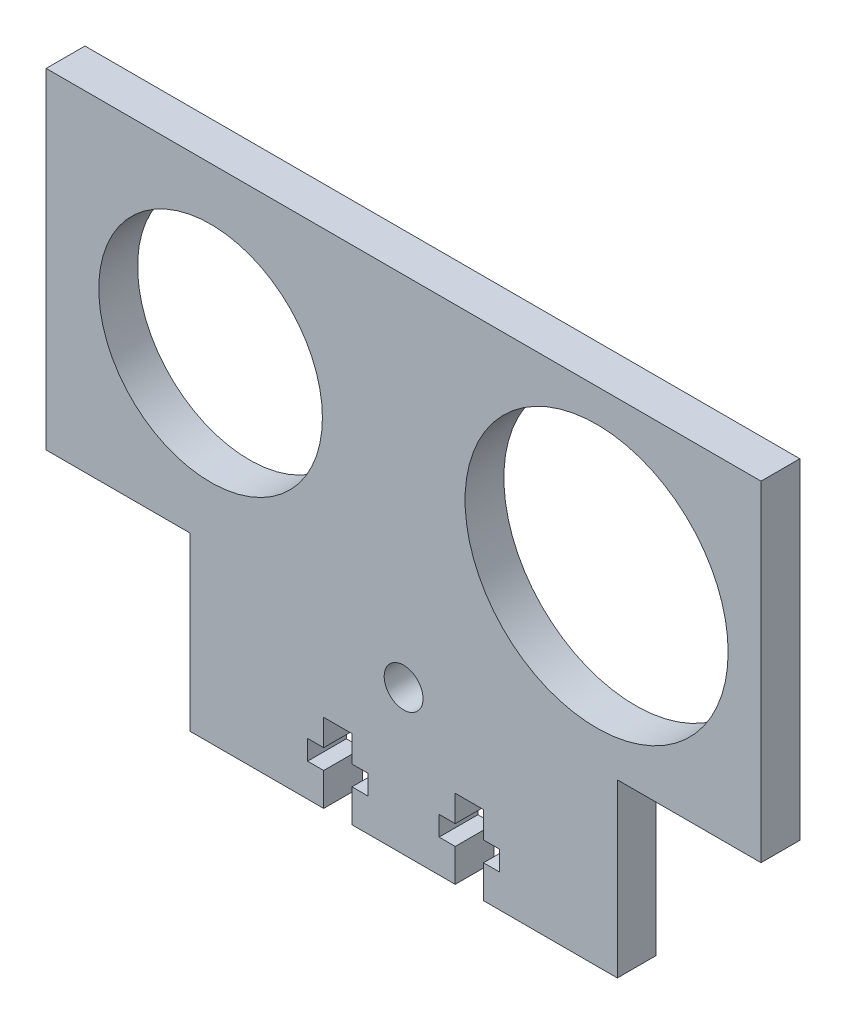
ISO-10303-21;
HEADER;
FILE_DESCRIPTION(('STEP AP214'),'2;1');
FILE_NAME('part.step','',(''),(''),'','','');
FILE_SCHEMA(('AUTOMOTIVE_DESIGN { 1 0 10303 214 1 1 1 1 }'));
ENDSEC;
DATA;
#1=APPLICATION_CONTEXT('core data for automotive mechanical design processes');
#2=APPLICATION_PROTOCOL_DEFINITION('international standard','automotive_design',2000,#1);
#3=PRODUCT_CONTEXT('',#1,'mechanical');
#4=PRODUCT('Part','Part','',(#3));
#5=PRODUCT_RELATED_PRODUCT_CATEGORY('part','',(#4));
#6=PRODUCT_DEFINITION_FORMATION('','',#4);
#7=PRODUCT_DEFINITION_CONTEXT('part definition',#1,'design');
#8=PRODUCT_DEFINITION('design','',#6,#7);
#9=PRODUCT_DEFINITION_SHAPE('','',#8);
#10=(LENGTH_UNIT() NAMED_UNIT(*) SI_UNIT(.MILLI.,.METRE.));
#11=(NAMED_UNIT(*) PLANE_ANGLE_UNIT() SI_UNIT($,.RADIAN.));
#12=(NAMED_UNIT(*) SI_UNIT($,.STERADIAN.) SOLID_ANGLE_UNIT());
#13=UNCERTAINTY_MEASURE_WITH_UNIT(LENGTH_MEASURE(1.E-05),#10,'distance_accuracy_value','');
#14=(GEOMETRIC_REPRESENTATION_CONTEXT(3) GLOBAL_UNCERTAINTY_ASSIGNED_CONTEXT((#13)) GLOBAL_UNIT_ASSIGNED_CONTEXT((#10,
#11,#12)) REPRESENTATION_CONTEXT('',''));
#15=CARTESIAN_POINT('',(0.,0.,0.));
#16=DIRECTION('',(0.,0.,1.));
#17=DIRECTION('',(1.,0.,0.));
#18=AXIS2_PLACEMENT_3D('',#15,#16,#17);
#19=CARTESIAN_POINT('',(-32.5,-22.,5.9));
#20=DIRECTION('',(0.,1.,0.));
#21=DIRECTION('',(-1.,0.,0.));
#22=AXIS2_PLACEMENT_3D('',#19,#20,#21);
#23=PLANE('',#22);
#24=DIRECTION('',(1.,0.,0.));
#25=VECTOR('',#24,1.);
#26=CARTESIAN_POINT('',(-32.5,-22.,5.9));
#27=LINE('',#26,#25);
#28=CARTESIAN_POINT('',(12.15,-22.,5.9));
#29=VERTEX_POINT('',#28);
#30=CARTESIAN_POINT('',(32.5,-22.,5.9));
#31=VERTEX_POINT('',#30);
#32=EDGE_CURVE('E464',#29,#31,#27,.T.);
#33=ORIENTED_EDGE('',*,*,#32,.F.);
#34=DIRECTION('',(0.,0.,1.));
#35=VECTOR('',#34,1.);
#36=CARTESIAN_POINT('',(12.15,-22.,0.));
#37=LINE('',#36,#35);
#38=CARTESIAN_POINT('',(12.15,-22.,0.));
#39=VERTEX_POINT('',#38);
#40=EDGE_CURVE('E335',#39,#29,#37,.T.);
#41=ORIENTED_EDGE('',*,*,#40,.F.);
#42=DIRECTION('',(1.,0.,0.));
#43=VECTOR('',#42,1.);
#44=CARTESIAN_POINT('',(-32.5,-22.,0.));
#45=LINE('',#44,#43);
#46=CARTESIAN_POINT('',(32.5,-22.,0.));
#47=VERTEX_POINT('',#46);
#48=EDGE_CURVE('E484',#39,#47,#45,.T.);
#49=ORIENTED_EDGE('',*,*,#48,.T.);
#50=DIRECTION('',(0.,0.,-1.));
#51=VECTOR('',#50,1.);
#52=CARTESIAN_POINT('',(32.5,-22.,5.9));
#53=LINE('',#52,#51);
#54=EDGE_CURVE('E468',#31,#47,#53,.T.);
#55=ORIENTED_EDGE('',*,*,#54,.F.);
#56=EDGE_LOOP('',(#33,#41,#49,#55));
#57=FACE_BOUND('',#56,.T.);
#58=ADVANCED_FACE('F32',(#57),#23,.F.);
#59=CARTESIAN_POINT('',(-32.5,-22.,0.));
#60=VERTEX_POINT('',#59);
#61=CARTESIAN_POINT('',(-12.15,-22.,0.));
#62=VERTEX_POINT('',#61);
#63=EDGE_CURVE('E452',#60,#62,#45,.T.);
#64=ORIENTED_EDGE('',*,*,#63,.T.);
#65=DIRECTION('',(0.,0.,1.));
#66=VECTOR('',#65,1.);
#67=CARTESIAN_POINT('',(-12.15,-22.,0.));
#68=LINE('',#67,#66);
#69=CARTESIAN_POINT('',(-12.15,-22.,5.9));
#70=VERTEX_POINT('',#69);
#71=EDGE_CURVE('E374',#62,#70,#68,.T.);
#72=ORIENTED_EDGE('',*,*,#71,.T.);
#73=CARTESIAN_POINT('',(-32.5,-22.,5.9));
#74=VERTEX_POINT('',#73);
#75=EDGE_CURVE('E465',#74,#70,#27,.T.);
#76=ORIENTED_EDGE('',*,*,#75,.F.);
#77=DIRECTION('',(0.,0.,-1.));
#78=VECTOR('',#77,1.);
#79=CARTESIAN_POINT('',(-32.5,-22.,5.9));
#80=LINE('',#79,#78);
#81=EDGE_CURVE('E490',#74,#60,#80,.T.);
#82=ORIENTED_EDGE('',*,*,#81,.T.);
#83=EDGE_LOOP('',(#64,#72,#76,#82));
#84=FACE_BOUND('',#83,.T.);
#85=ADVANCED_FACE('F553',(#84),#23,.F.);
#86=CARTESIAN_POINT('',(0.,0.,5.9));
#87=DIRECTION('',(0.,0.,1.));
#88=DIRECTION('',(1.,0.,0.));
#89=AXIS2_PLACEMENT_3D('',#86,#87,#88);
#90=PLANE('',#89);
#91=DIRECTION('',(0.,1.,0.));
#92=VECTOR('',#91,1.);
#93=CARTESIAN_POINT('',(12.15,-22.,5.9));
#94=LINE('',#93,#92);
#95=CARTESIAN_POINT('',(12.15,-17.,5.9));
#96=VERTEX_POINT('',#95);
#97=EDGE_CURVE('E303',#29,#96,#94,.T.);
#98=ORIENTED_EDGE('',*,*,#97,.F.);
#99=ORIENTED_EDGE('',*,*,#32,.T.);
#100=DIRECTION('',(0.,1.,0.));
#101=VECTOR('',#100,1.);
#102=CARTESIAN_POINT('',(32.5,4.10000000000001,5.9));
#103=LINE('',#102,#101);
#104=CARTESIAN_POINT('',(32.5,4.10000000000001,5.9));
#105=VERTEX_POINT('',#104);
#106=EDGE_CURVE('E448',#31,#105,#103,.T.);
#107=ORIENTED_EDGE('',*,*,#106,.T.);
#108=DIRECTION('',(1.,0.,0.));
#109=VECTOR('',#108,1.);
#110=CARTESIAN_POINT('',(32.5,4.10000000000001,5.9));
#111=LINE('',#110,#109);
#112=CARTESIAN_POINT('',(54.3449314192418,4.10000000000002,5.9));
#113=VERTEX_POINT('',#112);
#114=EDGE_CURVE('E451',#105,#113,#111,.T.);
#115=ORIENTED_EDGE('',*,*,#114,.T.);
#116=DIRECTION('',(0.,1.,0.));
#117=VECTOR('',#116,1.);
#118=CARTESIAN_POINT('',(54.3449314192418,4.10000000000002,5.9));
#119=LINE('',#118,#117);
#120=CARTESIAN_POINT('',(54.3449314192418,54.3449314192417,5.9));
#121=VERTEX_POINT('',#120);
#122=EDGE_CURVE('E454',#113,#121,#119,.T.);
#123=ORIENTED_EDGE('',*,*,#122,.T.);
#124=DIRECTION('',(-1.,0.,0.));
#125=VECTOR('',#124,1.);
#126=CARTESIAN_POINT('',(-54.3449314192418,54.3449314192417,5.9));
#127=LINE('',#126,#125);
#128=CARTESIAN_POINT('',(-54.3449314192418,54.3449314192417,5.9));
#129=VERTEX_POINT('',#128);
#130=EDGE_CURVE('E456',#121,#129,#127,.T.);
#131=ORIENTED_EDGE('',*,*,#130,.T.);
#132=DIRECTION('',(0.,-1.,0.));
#133=VECTOR('',#132,1.);
#134=CARTESIAN_POINT('',(-54.3449314192418,4.1,5.9));
#135=LINE('',#134,#133);
#136=CARTESIAN_POINT('',(-54.3449314192418,4.1,5.9));
#137=VERTEX_POINT('',#136);
#138=EDGE_CURVE('E458',#129,#137,#135,.T.);
#139=ORIENTED_EDGE('',*,*,#138,.T.);
#140=DIRECTION('',(1.,0.,0.));
#141=VECTOR('',#140,1.);
#142=CARTESIAN_POINT('',(-32.5,4.1,5.9));
#143=LINE('',#142,#141);
#144=CARTESIAN_POINT('',(-32.5,4.1,5.9));
#145=VERTEX_POINT('',#144);
#146=EDGE_CURVE('E460',#137,#145,#143,.T.);
#147=ORIENTED_EDGE('',*,*,#146,.T.);
#148=DIRECTION('',(0.,-1.,0.));
#149=VECTOR('',#148,1.);
#150=CARTESIAN_POINT('',(-32.5,4.1,5.9));
#151=LINE('',#150,#149);
#152=EDGE_CURVE('E462',#145,#74,#151,.T.);
#153=ORIENTED_EDGE('',*,*,#152,.T.);
#154=ORIENTED_EDGE('',*,*,#75,.T.);
#155=DIRECTION('',(0.,-1.,0.));
#156=VECTOR('',#155,1.);
#157=CARTESIAN_POINT('',(-12.15,-22.,5.9));
#158=LINE('',#157,#156);
#159=CARTESIAN_POINT('',(-12.15,-17.,5.9));
#160=VERTEX_POINT('',#159);
#161=EDGE_CURVE('E322',#160,#70,#158,.T.);
#162=ORIENTED_EDGE('',*,*,#161,.F.);
#163=DIRECTION('',(1.,0.,0.));
#164=VECTOR('',#163,1.);
#165=CARTESIAN_POINT('',(-14.6,-17.,5.9));
#166=LINE('',#165,#164);
#167=CARTESIAN_POINT('',(-14.6,-17.,5.9));
#168=VERTEX_POINT('',#167);
#169=EDGE_CURVE('E345',#168,#160,#166,.T.);
#170=ORIENTED_EDGE('',*,*,#169,.F.);
#171=DIRECTION('',(0.,-1.,0.));
#172=VECTOR('',#171,1.);
#173=CARTESIAN_POINT('',(-14.6,-14.,5.9));
#174=LINE('',#173,#172);
#175=CARTESIAN_POINT('',(-14.6,-14.,5.9));
#176=VERTEX_POINT('',#175);
#177=EDGE_CURVE('E400',#176,#168,#174,.T.);
#178=ORIENTED_EDGE('',*,*,#177,.F.);
#179=DIRECTION('',(-1.,0.,0.));
#180=VECTOR('',#179,1.);
#181=CARTESIAN_POINT('',(-14.6,-14.,5.9));
#182=LINE('',#181,#180);
#183=CARTESIAN_POINT('',(-12.15,-14.,5.9));
#184=VERTEX_POINT('',#183);
#185=EDGE_CURVE('E397',#184,#176,#182,.T.);
#186=ORIENTED_EDGE('',*,*,#185,.F.);
#187=DIRECTION('',(0.,-1.,0.));
#188=VECTOR('',#187,1.);
#189=CARTESIAN_POINT('',(-12.15,-14.,5.9));
#190=LINE('',#189,#188);
#191=CARTESIAN_POINT('',(-12.15,-10.,5.9));
#192=VERTEX_POINT('',#191);
#193=EDGE_CURVE('E394',#192,#184,#190,.T.);
#194=ORIENTED_EDGE('',*,*,#193,.F.);
#195=DIRECTION('',(-1.,0.,0.));
#196=VECTOR('',#195,1.);
#197=CARTESIAN_POINT('',(-12.15,-10.,5.9));
#198=LINE('',#197,#196);
#199=CARTESIAN_POINT('',(-7.85,-10.,5.9));
#200=VERTEX_POINT('',#199);
#201=EDGE_CURVE('E391',#200,#192,#198,.T.);
#202=ORIENTED_EDGE('',*,*,#201,.F.);
#203=DIRECTION('',(0.,1.,0.));
#204=VECTOR('',#203,1.);
#205=CARTESIAN_POINT('',(-7.84999999999999,-14.,5.9));
#206=LINE('',#205,#204);
#207=CARTESIAN_POINT('',(-7.84999999999999,-14.,5.9));
#208=VERTEX_POINT('',#207);
#209=EDGE_CURVE('E388',#208,#200,#206,.T.);
#210=ORIENTED_EDGE('',*,*,#209,.F.);
#211=DIRECTION('',(-1.,0.,0.));
#212=VECTOR('',#211,1.);
#213=CARTESIAN_POINT('',(-7.84999999999999,-14.,5.9));
#214=LINE('',#213,#212);
#215=CARTESIAN_POINT('',(-5.4,-14.,5.9));
#216=VERTEX_POINT('',#215);
#217=EDGE_CURVE('E385',#216,#208,#214,.T.);
#218=ORIENTED_EDGE('',*,*,#217,.F.);
#219=DIRECTION('',(0.,1.,0.));
#220=VECTOR('',#219,1.);
#221=CARTESIAN_POINT('',(-5.4,-14.,5.9));
#222=LINE('',#221,#220);
#223=CARTESIAN_POINT('',(-5.4,-17.,5.9));
#224=VERTEX_POINT('',#223);
#225=EDGE_CURVE('E382',#224,#216,#222,.T.);
#226=ORIENTED_EDGE('',*,*,#225,.F.);
#227=DIRECTION('',(1.,0.,0.));
#228=VECTOR('',#227,1.);
#229=CARTESIAN_POINT('',(-7.85,-17.,5.9));
#230=LINE('',#229,#228);
#231=CARTESIAN_POINT('',(-7.85,-17.,5.9));
#232=VERTEX_POINT('',#231);
#233=EDGE_CURVE('E379',#232,#224,#230,.T.);
#234=ORIENTED_EDGE('',*,*,#233,.F.);
#235=DIRECTION('',(0.,1.,0.));
#236=VECTOR('',#235,1.);
#237=CARTESIAN_POINT('',(-7.85,-22.,5.9));
#238=LINE('',#237,#236);
#239=CARTESIAN_POINT('',(-7.85,-22.,5.9));
#240=VERTEX_POINT('',#239);
#241=EDGE_CURVE('E376',#240,#232,#238,.T.);
#242=ORIENTED_EDGE('',*,*,#241,.F.);
#243=CARTESIAN_POINT('',(7.85,-22.,5.9));
#244=VERTEX_POINT('',#243);
#245=EDGE_CURVE('E469',#240,#244,#27,.T.);
#246=ORIENTED_EDGE('',*,*,#245,.T.);
#247=DIRECTION('',(0.,-1.,0.));
#248=VECTOR('',#247,1.);
#249=CARTESIAN_POINT('',(7.85,-22.,5.9));
#250=LINE('',#249,#248);
#251=CARTESIAN_POINT('',(7.85,-17.,5.9));
#252=VERTEX_POINT('',#251);
#253=EDGE_CURVE('E47',#252,#244,#250,.T.);
#254=ORIENTED_EDGE('',*,*,#253,.F.);
#255=DIRECTION('',(1.,0.,0.));
#256=VECTOR('',#255,1.);
#257=CARTESIAN_POINT('',(7.85,-17.,5.9));
#258=LINE('',#257,#256);
#259=CARTESIAN_POINT('',(5.4,-17.,5.9));
#260=VERTEX_POINT('',#259);
#261=EDGE_CURVE('E299',#260,#252,#258,.T.);
#262=ORIENTED_EDGE('',*,*,#261,.F.);
#263=DIRECTION('',(0.,-1.,0.));
#264=VECTOR('',#263,1.);
#265=CARTESIAN_POINT('',(5.4,-14.,5.9));
#266=LINE('',#265,#264);
#267=CARTESIAN_POINT('',(5.4,-14.,5.9));
#268=VERTEX_POINT('',#267);
#269=EDGE_CURVE('E297',#268,#260,#266,.T.);
#270=ORIENTED_EDGE('',*,*,#269,.F.);
#271=DIRECTION('',(-1.,0.,0.));
#272=VECTOR('',#271,1.);
#273=CARTESIAN_POINT('',(7.85,-14.,5.9));
#274=LINE('',#273,#272);
#275=CARTESIAN_POINT('',(7.85,-14.,5.9));
#276=VERTEX_POINT('',#275);
#277=EDGE_CURVE('E248',#276,#268,#274,.T.);
#278=ORIENTED_EDGE('',*,*,#277,.F.);
#279=DIRECTION('',(0.,-1.,0.));
#280=VECTOR('',#279,1.);
#281=CARTESIAN_POINT('',(7.85,-14.,5.9));
#282=LINE('',#281,#280);
#283=CARTESIAN_POINT('',(7.85,-10.,5.9));
#284=VERTEX_POINT('',#283);
#285=EDGE_CURVE('E268',#284,#276,#282,.T.);
#286=ORIENTED_EDGE('',*,*,#285,.F.);
#287=DIRECTION('',(-1.,0.,0.));
#288=VECTOR('',#287,1.);
#289=CARTESIAN_POINT('',(12.15,-9.99999999999999,5.9));
#290=LINE('',#289,#288);
#291=CARTESIAN_POINT('',(12.15,-9.99999999999999,5.9));
#292=VERTEX_POINT('',#291);
#293=EDGE_CURVE('E271',#292,#284,#290,.T.);
#294=ORIENTED_EDGE('',*,*,#293,.F.);
#295=DIRECTION('',(0.,1.,0.));
#296=VECTOR('',#295,1.);
#297=CARTESIAN_POINT('',(12.15,-14.,5.9));
#298=LINE('',#297,#296);
#299=CARTESIAN_POINT('',(12.15,-14.,5.9));
#300=VERTEX_POINT('',#299);
#301=EDGE_CURVE('E315',#300,#292,#298,.T.);
#302=ORIENTED_EDGE('',*,*,#301,.F.);
#303=DIRECTION('',(-1.,0.,0.));
#304=VECTOR('',#303,1.);
#305=CARTESIAN_POINT('',(14.6,-14.,5.9));
#306=LINE('',#305,#304);
#307=CARTESIAN_POINT('',(14.6,-14.,5.9));
#308=VERTEX_POINT('',#307);
#309=EDGE_CURVE('E312',#308,#300,#306,.T.);
#310=ORIENTED_EDGE('',*,*,#309,.F.);
#311=DIRECTION('',(0.,1.,0.));
#312=VECTOR('',#311,1.);
#313=CARTESIAN_POINT('',(14.6,-14.,5.9));
#314=LINE('',#313,#312);
#315=CARTESIAN_POINT('',(14.6,-17.,5.9));
#316=VERTEX_POINT('',#315);
#317=EDGE_CURVE('E309',#316,#308,#314,.T.);
#318=ORIENTED_EDGE('',*,*,#317,.F.);
#319=DIRECTION('',(1.,0.,0.));
#320=VECTOR('',#319,1.);
#321=CARTESIAN_POINT('',(14.6,-17.,5.9));
#322=LINE('',#321,#320);
#323=EDGE_CURVE('E306',#96,#316,#322,.T.);
#324=ORIENTED_EDGE('',*,*,#323,.F.);
#325=EDGE_LOOP('',(#98,#99,#107,#115,#123,#131,#139,#147,#153,#154,#162,#170,#178,#186,#194,
#202,#210,#218,#226,#234,#242,#246,#254,#262,#270,#278,#286,#294,#302,#310,#318,#324));
#326=FACE_BOUND('',#325,.T.);
#327=CARTESIAN_POINT('',(-29.3449314192418,29.3449314192417,5.9));
#328=DIRECTION('',(0.,0.,1.));
#329=DIRECTION('',(1.,0.,0.));
#330=AXIS2_PLACEMENT_3D('',#327,#328,#329);
#331=CIRCLE('',#330,17.);
#332=CARTESIAN_POINT('',(-12.3449314192418,29.3449314192417,5.9));
#333=VERTEX_POINT('',#332);
#334=EDGE_CURVE('E436',#333,#333,#331,.T.);
#335=ORIENTED_EDGE('',*,*,#334,.F.);
#336=EDGE_LOOP('',(#335));
#337=FACE_BOUND('',#336,.T.);
#338=CARTESIAN_POINT('',(0.,0.,5.9));
#339=DIRECTION('',(0.,0.,1.));
#340=DIRECTION('',(1.,0.,0.));
#341=AXIS2_PLACEMENT_3D('',#338,#339,#340);
#342=CIRCLE('',#341,2.95);
#343=CARTESIAN_POINT('',(2.95,0.,5.9));
#344=VERTEX_POINT('',#343);
#345=EDGE_CURVE('E442',#344,#344,#342,.T.);
#346=ORIENTED_EDGE('',*,*,#345,.F.);
#347=EDGE_LOOP('',(#346));
#348=FACE_BOUND('',#347,.T.);
#349=CARTESIAN_POINT('',(29.3449314192418,29.3449314192417,5.9));
#350=DIRECTION('',(0.,0.,1.));
#351=DIRECTION('',(1.,0.,0.));
#352=AXIS2_PLACEMENT_3D('',#349,#350,#351);
#353=CIRCLE('',#352,20.);
#354=CARTESIAN_POINT('',(49.3449314192418,29.3449314192417,5.9));
#355=VERTEX_POINT('',#354);
#356=EDGE_CURVE('E430',#355,#355,#353,.T.);
#357=ORIENTED_EDGE('',*,*,#356,.F.);
#358=EDGE_LOOP('',(#357));
#359=FACE_BOUND('',#358,.T.);
#360=ADVANCED_FACE('F527',(#326,#337,#348,#359),#90,.T.);
#361=CARTESIAN_POINT('',(0.,0.,0.));
#362=DIRECTION('',(0.,0.,1.));
#363=DIRECTION('',(1.,0.,0.));
#364=AXIS2_PLACEMENT_3D('',#361,#362,#363);
#365=PLANE('',#364);
#366=ORIENTED_EDGE('',*,*,#48,.F.);
#367=DIRECTION('',(0.,1.,0.));
#368=VECTOR('',#367,1.);
#369=CARTESIAN_POINT('',(12.15,-22.,0.));
#370=LINE('',#369,#368);
#371=CARTESIAN_POINT('',(12.15,-17.,0.));
#372=VERTEX_POINT('',#371);
#373=EDGE_CURVE('E278',#39,#372,#370,.T.);
#374=ORIENTED_EDGE('',*,*,#373,.T.);
#375=DIRECTION('',(1.,0.,0.));
#376=VECTOR('',#375,1.);
#377=CARTESIAN_POINT('',(14.6,-17.,0.));
#378=LINE('',#377,#376);
#379=CARTESIAN_POINT('',(14.6,-17.,0.));
#380=VERTEX_POINT('',#379);
#381=EDGE_CURVE('E281',#372,#380,#378,.T.);
#382=ORIENTED_EDGE('',*,*,#381,.T.);
#383=DIRECTION('',(0.,1.,0.));
#384=VECTOR('',#383,1.);
#385=CARTESIAN_POINT('',(14.6,-14.,0.));
#386=LINE('',#385,#384);
#387=CARTESIAN_POINT('',(14.6,-14.,0.));
#388=VERTEX_POINT('',#387);
#389=EDGE_CURVE('E284',#380,#388,#386,.T.);
#390=ORIENTED_EDGE('',*,*,#389,.T.);
#391=DIRECTION('',(-1.,0.,0.));
#392=VECTOR('',#391,1.);
#393=CARTESIAN_POINT('',(14.6,-14.,0.));
#394=LINE('',#393,#392);
#395=CARTESIAN_POINT('',(12.15,-14.,0.));
#396=VERTEX_POINT('',#395);
#397=EDGE_CURVE('E287',#388,#396,#394,.T.);
#398=ORIENTED_EDGE('',*,*,#397,.T.);
#399=DIRECTION('',(0.,1.,0.));
#400=VECTOR('',#399,1.);
#401=CARTESIAN_POINT('',(12.15,-14.,0.));
#402=LINE('',#401,#400);
#403=CARTESIAN_POINT('',(12.15,-9.99999999999999,0.));
#404=VERTEX_POINT('',#403);
#405=EDGE_CURVE('E290',#396,#404,#402,.T.);
#406=ORIENTED_EDGE('',*,*,#405,.T.);
#407=DIRECTION('',(-1.,0.,0.));
#408=VECTOR('',#407,1.);
#409=CARTESIAN_POINT('',(12.15,-9.99999999999999,0.));
#410=LINE('',#409,#408);
#411=CARTESIAN_POINT('',(7.85,-10.,0.));
#412=VERTEX_POINT('',#411);
#413=EDGE_CURVE('E293',#404,#412,#410,.T.);
#414=ORIENTED_EDGE('',*,*,#413,.T.);
#415=DIRECTION('',(0.,-1.,0.));
#416=VECTOR('',#415,1.);
#417=CARTESIAN_POINT('',(7.85,-14.,0.));
#418=LINE('',#417,#416);
#419=CARTESIAN_POINT('',(7.85,-14.,0.));
#420=VERTEX_POINT('',#419);
#421=EDGE_CURVE('E253',#412,#420,#418,.T.);
#422=ORIENTED_EDGE('',*,*,#421,.T.);
#423=DIRECTION('',(-1.,0.,0.));
#424=VECTOR('',#423,1.);
#425=CARTESIAN_POINT('',(7.85,-14.,0.));
#426=LINE('',#425,#424);
#427=CARTESIAN_POINT('',(5.4,-14.,0.));
#428=VERTEX_POINT('',#427);
#429=EDGE_CURVE('E245',#420,#428,#426,.T.);
#430=ORIENTED_EDGE('',*,*,#429,.T.);
#431=DIRECTION('',(0.,-1.,0.));
#432=VECTOR('',#431,1.);
#433=CARTESIAN_POINT('',(5.4,-14.,0.));
#434=LINE('',#433,#432);
#435=CARTESIAN_POINT('',(5.4,-17.,0.));
#436=VERTEX_POINT('',#435);
#437=EDGE_CURVE('E256',#428,#436,#434,.T.);
#438=ORIENTED_EDGE('',*,*,#437,.T.);
#439=DIRECTION('',(1.,0.,0.));
#440=VECTOR('',#439,1.);
#441=CARTESIAN_POINT('',(7.85,-17.,0.));
#442=LINE('',#441,#440);
#443=CARTESIAN_POINT('',(7.85,-17.,0.));
#444=VERTEX_POINT('',#443);
#445=EDGE_CURVE('E261',#436,#444,#442,.T.);
#446=ORIENTED_EDGE('',*,*,#445,.T.);
#447=DIRECTION('',(0.,-1.,0.));
#448=VECTOR('',#447,1.);
#449=CARTESIAN_POINT('',(7.85,-22.,0.));
#450=LINE('',#449,#448);
#451=CARTESIAN_POINT('',(7.85,-22.,0.));
#452=VERTEX_POINT('',#451);
#453=EDGE_CURVE('E275',#444,#452,#450,.T.);
#454=ORIENTED_EDGE('',*,*,#453,.T.);
#455=CARTESIAN_POINT('',(-7.85,-22.,0.));
#456=VERTEX_POINT('',#455);
#457=EDGE_CURVE('E487',#456,#452,#45,.T.);
#458=ORIENTED_EDGE('',*,*,#457,.F.);
#459=DIRECTION('',(0.,1.,0.));
#460=VECTOR('',#459,1.);
#461=CARTESIAN_POINT('',(-7.85,-22.,0.));
#462=LINE('',#461,#460);
#463=CARTESIAN_POINT('',(-7.85,-17.,0.));
#464=VERTEX_POINT('',#463);
#465=EDGE_CURVE('E55',#456,#464,#462,.T.);
#466=ORIENTED_EDGE('',*,*,#465,.T.);
#467=DIRECTION('',(1.,0.,0.));
#468=VECTOR('',#467,1.);
#469=CARTESIAN_POINT('',(-7.85,-17.,0.));
#470=LINE('',#469,#468);
#471=CARTESIAN_POINT('',(-5.4,-17.,0.));
#472=VERTEX_POINT('',#471);
#473=EDGE_CURVE('E347',#464,#472,#470,.T.);
#474=ORIENTED_EDGE('',*,*,#473,.T.);
#475=DIRECTION('',(0.,1.,0.));
#476=VECTOR('',#475,1.);
#477=CARTESIAN_POINT('',(-5.4,-14.,0.));
#478=LINE('',#477,#476);
#479=CARTESIAN_POINT('',(-5.4,-14.,0.));
#480=VERTEX_POINT('',#479);
#481=EDGE_CURVE('E350',#472,#480,#478,.T.);
#482=ORIENTED_EDGE('',*,*,#481,.T.);
#483=DIRECTION('',(-1.,0.,0.));
#484=VECTOR('',#483,1.);
#485=CARTESIAN_POINT('',(-7.84999999999999,-14.,0.));
#486=LINE('',#485,#484);
#487=CARTESIAN_POINT('',(-7.84999999999999,-14.,0.));
#488=VERTEX_POINT('',#487);
#489=EDGE_CURVE('E353',#480,#488,#486,.T.);
#490=ORIENTED_EDGE('',*,*,#489,.T.);
#491=DIRECTION('',(0.,1.,0.));
#492=VECTOR('',#491,1.);
#493=CARTESIAN_POINT('',(-7.84999999999999,-14.,0.));
#494=LINE('',#493,#492);
#495=CARTESIAN_POINT('',(-7.85,-10.,0.));
#496=VERTEX_POINT('',#495);
#497=EDGE_CURVE('E356',#488,#496,#494,.T.);
#498=ORIENTED_EDGE('',*,*,#497,.T.);
#499=DIRECTION('',(-1.,0.,0.));
#500=VECTOR('',#499,1.);
#501=CARTESIAN_POINT('',(-12.15,-10.,0.));
#502=LINE('',#501,#500);
#503=CARTESIAN_POINT('',(-12.15,-10.,0.));
#504=VERTEX_POINT('',#503);
#505=EDGE_CURVE('E359',#496,#504,#502,.T.);
#506=ORIENTED_EDGE('',*,*,#505,.T.);
#507=DIRECTION('',(0.,-1.,0.));
#508=VECTOR('',#507,1.);
#509=CARTESIAN_POINT('',(-12.15,-14.,0.));
#510=LINE('',#509,#508);
#511=CARTESIAN_POINT('',(-12.15,-14.,0.));
#512=VERTEX_POINT('',#511);
#513=EDGE_CURVE('E362',#504,#512,#510,.T.);
#514=ORIENTED_EDGE('',*,*,#513,.T.);
#515=DIRECTION('',(-1.,0.,0.));
#516=VECTOR('',#515,1.);
#517=CARTESIAN_POINT('',(-14.6,-14.,0.));
#518=LINE('',#517,#516);
#519=CARTESIAN_POINT('',(-14.6,-14.,0.));
#520=VERTEX_POINT('',#519);
#521=EDGE_CURVE('E365',#512,#520,#518,.T.);
#522=ORIENTED_EDGE('',*,*,#521,.T.);
#523=DIRECTION('',(0.,-1.,0.));
#524=VECTOR('',#523,1.);
#525=CARTESIAN_POINT('',(-14.6,-14.,0.));
#526=LINE('',#525,#524);
#527=CARTESIAN_POINT('',(-14.6,-17.,0.));
#528=VERTEX_POINT('',#527);
#529=EDGE_CURVE('E368',#520,#528,#526,.T.);
#530=ORIENTED_EDGE('',*,*,#529,.T.);
#531=DIRECTION('',(1.,0.,0.));
#532=VECTOR('',#531,1.);
#533=CARTESIAN_POINT('',(-14.6,-17.,0.));
#534=LINE('',#533,#532);
#535=CARTESIAN_POINT('',(-12.15,-17.,0.));
#536=VERTEX_POINT('',#535);
#537=EDGE_CURVE('E371',#528,#536,#534,.T.);
#538=ORIENTED_EDGE('',*,*,#537,.T.);
#539=DIRECTION('',(0.,-1.,0.));
#540=VECTOR('',#539,1.);
#541=CARTESIAN_POINT('',(-12.15,-22.,0.));
#542=LINE('',#541,#540);
#543=EDGE_CURVE('E342',#536,#62,#542,.T.);
#544=ORIENTED_EDGE('',*,*,#543,.T.);
#545=ORIENTED_EDGE('',*,*,#63,.F.);
#546=DIRECTION('',(0.,-1.,0.));
#547=VECTOR('',#546,1.);
#548=CARTESIAN_POINT('',(-32.5,4.1,0.));
#549=LINE('',#548,#547);
#550=CARTESIAN_POINT('',(-32.5,4.1,0.));
#551=VERTEX_POINT('',#550);
#552=EDGE_CURVE('E482',#551,#60,#549,.T.);
#553=ORIENTED_EDGE('',*,*,#552,.F.);
#554=DIRECTION('',(1.,0.,0.));
#555=VECTOR('',#554,1.);
#556=CARTESIAN_POINT('',(-32.5,4.1,0.));
#557=LINE('',#556,#555);
#558=CARTESIAN_POINT('',(-54.3449314192418,4.1,0.));
#559=VERTEX_POINT('',#558);
#560=EDGE_CURVE('E480',#559,#551,#557,.T.);
#561=ORIENTED_EDGE('',*,*,#560,.F.);
#562=DIRECTION('',(0.,-1.,0.));
#563=VECTOR('',#562,1.);
#564=CARTESIAN_POINT('',(-54.3449314192418,4.1,0.));
#565=LINE('',#564,#563);
#566=CARTESIAN_POINT('',(-54.3449314192418,54.3449314192417,0.));
#567=VERTEX_POINT('',#566);
#568=EDGE_CURVE('E478',#567,#559,#565,.T.);
#569=ORIENTED_EDGE('',*,*,#568,.F.);
#570=DIRECTION('',(-1.,0.,0.));
#571=VECTOR('',#570,1.);
#572=CARTESIAN_POINT('',(-54.3449314192418,54.3449314192417,0.));
#573=LINE('',#572,#571);
#574=CARTESIAN_POINT('',(54.3449314192418,54.3449314192417,0.));
#575=VERTEX_POINT('',#574);
#576=EDGE_CURVE('E476',#575,#567,#573,.T.);
#577=ORIENTED_EDGE('',*,*,#576,.F.);
#578=DIRECTION('',(0.,1.,0.));
#579=VECTOR('',#578,1.);
#580=CARTESIAN_POINT('',(54.3449314192418,4.10000000000002,0.));
#581=LINE('',#580,#579);
#582=CARTESIAN_POINT('',(54.3449314192418,4.10000000000002,0.));
#583=VERTEX_POINT('',#582);
#584=EDGE_CURVE('E474',#583,#575,#581,.T.);
#585=ORIENTED_EDGE('',*,*,#584,.F.);
#586=DIRECTION('',(1.,0.,0.));
#587=VECTOR('',#586,1.);
#588=CARTESIAN_POINT('',(32.5,4.10000000000001,0.));
#589=LINE('',#588,#587);
#590=CARTESIAN_POINT('',(32.5,4.10000000000001,0.));
#591=VERTEX_POINT('',#590);
#592=EDGE_CURVE('E472',#591,#583,#589,.T.);
#593=ORIENTED_EDGE('',*,*,#592,.F.);
#594=DIRECTION('',(0.,1.,0.));
#595=VECTOR('',#594,1.);
#596=CARTESIAN_POINT('',(32.5,4.10000000000001,0.));
#597=LINE('',#596,#595);
#598=EDGE_CURVE('E445',#47,#591,#597,.T.);
#599=ORIENTED_EDGE('',*,*,#598,.F.);
#600=EDGE_LOOP('',(#366,#374,#382,#390,#398,#406,#414,#422,#430,#438,#446,#454,#458,#466,#474,
#482,#490,#498,#506,#514,#522,#530,#538,#544,#545,#553,#561,#569,#577,#585,#593,#599));
#601=FACE_BOUND('',#600,.T.);
#602=CARTESIAN_POINT('',(0.,0.,0.));
#603=DIRECTION('',(0.,0.,1.));
#604=DIRECTION('',(1.,0.,0.));
#605=AXIS2_PLACEMENT_3D('',#602,#603,#604);
#606=CIRCLE('',#605,2.95);
#607=CARTESIAN_POINT('',(2.95,0.,0.));
#608=VERTEX_POINT('',#607);
#609=EDGE_CURVE('E439',#608,#608,#606,.T.);
#610=ORIENTED_EDGE('',*,*,#609,.T.);
#611=EDGE_LOOP('',(#610));
#612=FACE_BOUND('',#611,.T.);
#613=CARTESIAN_POINT('',(-29.3449314192418,29.3449314192417,0.));
#614=DIRECTION('',(0.,0.,1.));
#615=DIRECTION('',(1.,0.,0.));
#616=AXIS2_PLACEMENT_3D('',#613,#614,#615);
#617=CIRCLE('',#616,17.);
#618=CARTESIAN_POINT('',(-12.3449314192418,29.3449314192417,0.));
#619=VERTEX_POINT('',#618);
#620=EDGE_CURVE('E433',#619,#619,#617,.T.);
#621=ORIENTED_EDGE('',*,*,#620,.T.);
#622=EDGE_LOOP('',(#621));
#623=FACE_BOUND('',#622,.T.);
#624=CARTESIAN_POINT('',(29.3449314192418,29.3449314192417,0.));
#625=DIRECTION('',(0.,0.,1.));
#626=DIRECTION('',(1.,0.,0.));
#627=AXIS2_PLACEMENT_3D('',#624,#625,#626);
#628=CIRCLE('',#627,20.);
#629=CARTESIAN_POINT('',(49.3449314192418,29.3449314192417,0.));
#630=VERTEX_POINT('',#629);
#631=EDGE_CURVE('E407',#630,#630,#628,.T.);
#632=ORIENTED_EDGE('',*,*,#631,.T.);
#633=EDGE_LOOP('',(#632));
#634=FACE_BOUND('',#633,.T.);
#635=ADVANCED_FACE('F264',(#601,#612,#623,#634),#365,.F.);
#636=CARTESIAN_POINT('',(32.5,4.10000000000001,5.9));
#637=DIRECTION('',(-1.,0.,0.));
#638=DIRECTION('',(0.,-1.,0.));
#639=AXIS2_PLACEMENT_3D('',#636,#637,#638);
#640=PLANE('',#639);
#641=ORIENTED_EDGE('',*,*,#598,.T.);
#642=DIRECTION('',(0.,0.,-1.));
#643=VECTOR('',#642,1.);
#644=CARTESIAN_POINT('',(32.5,4.10000000000001,5.9));
#645=LINE('',#644,#643);
#646=EDGE_CURVE('E11',#105,#591,#645,.T.);
#647=ORIENTED_EDGE('',*,*,#646,.F.);
#648=ORIENTED_EDGE('',*,*,#106,.F.);
#649=ORIENTED_EDGE('',*,*,#54,.T.);
#650=EDGE_LOOP('',(#641,#647,#648,#649));
#651=FACE_BOUND('',#650,.T.);
#652=ADVANCED_FACE('F34',(#651),#640,.F.);
#653=CARTESIAN_POINT('',(32.5,4.10000000000001,5.9));
#654=DIRECTION('',(0.,1.,0.));
#655=DIRECTION('',(-1.,0.,0.));
#656=AXIS2_PLACEMENT_3D('',#653,#654,#655);
#657=PLANE('',#656);
#658=ORIENTED_EDGE('',*,*,#592,.T.);
#659=DIRECTION('',(0.,0.,-1.));
#660=VECTOR('',#659,1.);
#661=CARTESIAN_POINT('',(54.3449314192418,4.10000000000002,5.9));
#662=LINE('',#661,#660);
#663=EDGE_CURVE('E40',#113,#583,#662,.T.);
#664=ORIENTED_EDGE('',*,*,#663,.F.);
#665=ORIENTED_EDGE('',*,*,#114,.F.);
#666=ORIENTED_EDGE('',*,*,#646,.T.);
#667=EDGE_LOOP('',(#658,#664,#665,#666));
#668=FACE_BOUND('',#667,.T.);
#669=ADVANCED_FACE('F532',(#668),#657,.F.);
#670=CARTESIAN_POINT('',(54.3449314192418,4.10000000000002,5.9));
#671=DIRECTION('',(-1.,0.,0.));
#672=DIRECTION('',(0.,-1.,0.));
#673=AXIS2_PLACEMENT_3D('',#670,#671,#672);
#674=PLANE('',#673);
#675=ORIENTED_EDGE('',*,*,#584,.T.);
#676=DIRECTION('',(0.,0.,-1.));
#677=VECTOR('',#676,1.);
#678=CARTESIAN_POINT('',(54.3449314192418,54.3449314192417,5.9));
#679=LINE('',#678,#677);
#680=EDGE_CURVE('E502',#121,#575,#679,.T.);
#681=ORIENTED_EDGE('',*,*,#680,.F.);
#682=ORIENTED_EDGE('',*,*,#122,.F.);
#683=ORIENTED_EDGE('',*,*,#663,.T.);
#684=EDGE_LOOP('',(#675,#681,#682,#683));
#685=FACE_BOUND('',#684,.T.);
#686=ADVANCED_FACE('F509',(#685),#674,.F.);
#687=CARTESIAN_POINT('',(-54.3449314192418,54.3449314192417,5.9));
#688=DIRECTION('',(0.,-1.,0.));
#689=DIRECTION('',(1.,0.,0.));
#690=AXIS2_PLACEMENT_3D('',#687,#688,#689);
#691=PLANE('',#690);
#692=ORIENTED_EDGE('',*,*,#576,.T.);
#693=DIRECTION('',(0.,0.,-1.));
#694=VECTOR('',#693,1.);
#695=CARTESIAN_POINT('',(-54.3449314192418,54.3449314192417,5.9));
#696=LINE('',#695,#694);
#697=EDGE_CURVE('E499',#129,#567,#696,.T.);
#698=ORIENTED_EDGE('',*,*,#697,.F.);
#699=ORIENTED_EDGE('',*,*,#130,.F.);
#700=ORIENTED_EDGE('',*,*,#680,.T.);
#701=EDGE_LOOP('',(#692,#698,#699,#700));
#702=FACE_BOUND('',#701,.T.);
#703=ADVANCED_FACE('F518',(#702),#691,.F.);
#704=CARTESIAN_POINT('',(-54.3449314192418,4.1,5.9));
#705=DIRECTION('',(1.,0.,0.));
#706=DIRECTION('',(0.,0.,-1.));
#707=AXIS2_PLACEMENT_3D('',#704,#705,#706);
#708=PLANE('',#707);
#709=ORIENTED_EDGE('',*,*,#568,.T.);
#710=DIRECTION('',(0.,0.,-1.));
#711=VECTOR('',#710,1.);
#712=CARTESIAN_POINT('',(-54.3449314192418,4.1,5.9));
#713=LINE('',#712,#711);
#714=EDGE_CURVE('E496',#137,#559,#713,.T.);
#715=ORIENTED_EDGE('',*,*,#714,.F.);
#716=ORIENTED_EDGE('',*,*,#138,.F.);
#717=ORIENTED_EDGE('',*,*,#697,.T.);
#718=EDGE_LOOP('',(#709,#715,#716,#717));
#719=FACE_BOUND('',#718,.T.);
#720=ADVANCED_FACE('F522',(#719),#708,.F.);
#721=CARTESIAN_POINT('',(-32.5,4.1,5.9));
#722=DIRECTION('',(0.,1.,0.));
#723=DIRECTION('',(-1.,0.,0.));
#724=AXIS2_PLACEMENT_3D('',#721,#722,#723);
#725=PLANE('',#724);
#726=ORIENTED_EDGE('',*,*,#560,.T.);
#727=DIRECTION('',(0.,0.,-1.));
#728=VECTOR('',#727,1.);
#729=CARTESIAN_POINT('',(-32.5,4.1,5.9));
#730=LINE('',#729,#728);
#731=EDGE_CURVE('E493',#145,#551,#730,.T.);
#732=ORIENTED_EDGE('',*,*,#731,.F.);
#733=ORIENTED_EDGE('',*,*,#146,.F.);
#734=ORIENTED_EDGE('',*,*,#714,.T.);
#735=EDGE_LOOP('',(#726,#732,#733,#734));
#736=FACE_BOUND('',#735,.T.);
#737=ADVANCED_FACE('F571',(#736),#725,.F.);
#738=CARTESIAN_POINT('',(-32.5,4.1,5.9));
#739=DIRECTION('',(1.,0.,0.));
#740=DIRECTION('',(0.,1.,0.));
#741=AXIS2_PLACEMENT_3D('',#738,#739,#740);
#742=PLANE('',#741);
#743=ORIENTED_EDGE('',*,*,#552,.T.);
#744=ORIENTED_EDGE('',*,*,#81,.F.);
#745=ORIENTED_EDGE('',*,*,#152,.F.);
#746=ORIENTED_EDGE('',*,*,#731,.T.);
#747=EDGE_LOOP('',(#743,#744,#745,#746));
#748=FACE_BOUND('',#747,.T.);
#749=ADVANCED_FACE('F563',(#748),#742,.F.);
#750=ORIENTED_EDGE('',*,*,#457,.T.);
#751=DIRECTION('',(0.,0.,1.));
#752=VECTOR('',#751,1.);
#753=CARTESIAN_POINT('',(7.85,-22.,0.));
#754=LINE('',#753,#752);
#755=EDGE_CURVE('E337',#452,#244,#754,.T.);
#756=ORIENTED_EDGE('',*,*,#755,.T.);
#757=ORIENTED_EDGE('',*,*,#245,.F.);
#758=DIRECTION('',(0.,0.,1.));
#759=VECTOR('',#758,1.);
#760=CARTESIAN_POINT('',(-7.85,-22.,0.));
#761=LINE('',#760,#759);
#762=EDGE_CURVE('E426',#456,#240,#761,.T.);
#763=ORIENTED_EDGE('',*,*,#762,.F.);
#764=EDGE_LOOP('',(#750,#756,#757,#763));
#765=FACE_BOUND('',#764,.T.);
#766=ADVANCED_FACE('F540',(#765),#23,.F.);
#767=CARTESIAN_POINT('',(0.,0.,5.9));
#768=DIRECTION('',(0.,0.,-1.));
#769=DIRECTION('',(-1.,0.,0.));
#770=AXIS2_PLACEMENT_3D('',#767,#768,#769);
#771=CYLINDRICAL_SURFACE('',#770,2.95);
#772=ORIENTED_EDGE('',*,*,#345,.T.);
#773=EDGE_LOOP('',(#772));
#774=FACE_BOUND('',#773,.T.);
#775=ORIENTED_EDGE('',*,*,#609,.F.);
#776=EDGE_LOOP('',(#775));
#777=FACE_BOUND('',#776,.T.);
#778=ADVANCED_FACE('F562',(#774,#777),#771,.F.);
#779=CARTESIAN_POINT('',(-29.3449314192418,29.3449314192417,5.9));
#780=DIRECTION('',(0.,0.,-1.));
#781=DIRECTION('',(-1.,0.,0.));
#782=AXIS2_PLACEMENT_3D('',#779,#780,#781);
#783=CYLINDRICAL_SURFACE('',#782,17.);
#784=ORIENTED_EDGE('',*,*,#334,.T.);
#785=EDGE_LOOP('',(#784));
#786=FACE_BOUND('',#785,.T.);
#787=ORIENTED_EDGE('',*,*,#620,.F.);
#788=EDGE_LOOP('',(#787));
#789=FACE_BOUND('',#788,.T.);
#790=ADVANCED_FACE('F568',(#786,#789),#783,.F.);
#791=CARTESIAN_POINT('',(29.3449314192418,29.3449314192417,5.9));
#792=DIRECTION('',(0.,0.,-1.));
#793=DIRECTION('',(-1.,0.,0.));
#794=AXIS2_PLACEMENT_3D('',#791,#792,#793);
#795=CYLINDRICAL_SURFACE('',#794,20.);
#796=ORIENTED_EDGE('',*,*,#356,.T.);
#797=EDGE_LOOP('',(#796));
#798=FACE_BOUND('',#797,.T.);
#799=ORIENTED_EDGE('',*,*,#631,.F.);
#800=EDGE_LOOP('',(#799));
#801=FACE_BOUND('',#800,.T.);
#802=ADVANCED_FACE('F598',(#798,#801),#795,.F.);
#803=CARTESIAN_POINT('',(-12.15,-22.,0.));
#804=DIRECTION('',(-1.,0.,0.));
#805=DIRECTION('',(0.,0.,1.));
#806=AXIS2_PLACEMENT_3D('',#803,#804,#805);
#807=PLANE('',#806);
#808=ORIENTED_EDGE('',*,*,#161,.T.);
#809=ORIENTED_EDGE('',*,*,#71,.F.);
#810=ORIENTED_EDGE('',*,*,#543,.F.);
#811=DIRECTION('',(0.,0.,1.));
#812=VECTOR('',#811,1.);
#813=CARTESIAN_POINT('',(-12.15,-17.,0.));
#814=LINE('',#813,#812);
#815=EDGE_CURVE('E405',#536,#160,#814,.T.);
#816=ORIENTED_EDGE('',*,*,#815,.T.);
#817=EDGE_LOOP('',(#808,#809,#810,#816));
#818=FACE_BOUND('',#817,.T.);
#819=ADVANCED_FACE('F602',(#818),#807,.F.);
#820=CARTESIAN_POINT('',(-14.6,-17.,0.));
#821=DIRECTION('',(0.,-1.,0.));
#822=DIRECTION('',(0.,0.,-1.));
#823=AXIS2_PLACEMENT_3D('',#820,#821,#822);
#824=PLANE('',#823);
#825=ORIENTED_EDGE('',*,*,#169,.T.);
#826=ORIENTED_EDGE('',*,*,#815,.F.);
#827=ORIENTED_EDGE('',*,*,#537,.F.);
#828=DIRECTION('',(0.,0.,1.));
#829=VECTOR('',#828,1.);
#830=CARTESIAN_POINT('',(-14.6,-17.,0.));
#831=LINE('',#830,#829);
#832=EDGE_CURVE('E408',#528,#168,#831,.T.);
#833=ORIENTED_EDGE('',*,*,#832,.T.);
#834=EDGE_LOOP('',(#825,#826,#827,#833));
#835=FACE_BOUND('',#834,.T.);
#836=ADVANCED_FACE('F606',(#835),#824,.F.);
#837=CARTESIAN_POINT('',(-14.6,-14.,0.));
#838=DIRECTION('',(-1.,0.,0.));
#839=DIRECTION('',(0.,-1.,0.));
#840=AXIS2_PLACEMENT_3D('',#837,#838,#839);
#841=PLANE('',#840);
#842=ORIENTED_EDGE('',*,*,#177,.T.);
#843=ORIENTED_EDGE('',*,*,#832,.F.);
#844=ORIENTED_EDGE('',*,*,#529,.F.);
#845=DIRECTION('',(0.,0.,1.));
#846=VECTOR('',#845,1.);
#847=CARTESIAN_POINT('',(-14.6,-14.,0.));
#848=LINE('',#847,#846);
#849=EDGE_CURVE('E410',#520,#176,#848,.T.);
#850=ORIENTED_EDGE('',*,*,#849,.T.);
#851=EDGE_LOOP('',(#842,#843,#844,#850));
#852=FACE_BOUND('',#851,.T.);
#853=ADVANCED_FACE('F638',(#852),#841,.F.);
#854=CARTESIAN_POINT('',(-14.6,-14.,0.));
#855=DIRECTION('',(0.,1.,0.));
#856=DIRECTION('',(0.,0.,1.));
#857=AXIS2_PLACEMENT_3D('',#854,#855,#856);
#858=PLANE('',#857);
#859=ORIENTED_EDGE('',*,*,#185,.T.);
#860=ORIENTED_EDGE('',*,*,#849,.F.);
#861=ORIENTED_EDGE('',*,*,#521,.F.);
#862=DIRECTION('',(0.,0.,1.));
#863=VECTOR('',#862,1.);
#864=CARTESIAN_POINT('',(-12.15,-14.,0.));
#865=LINE('',#864,#863);
#866=EDGE_CURVE('E412',#512,#184,#865,.T.);
#867=ORIENTED_EDGE('',*,*,#866,.T.);
#868=EDGE_LOOP('',(#859,#860,#861,#867));
#869=FACE_BOUND('',#868,.T.);
#870=ADVANCED_FACE('F634',(#869),#858,.F.);
#871=CARTESIAN_POINT('',(-12.15,-14.,0.));
#872=DIRECTION('',(-1.,0.,0.));
#873=DIRECTION('',(0.,-1.,0.));
#874=AXIS2_PLACEMENT_3D('',#871,#872,#873);
#875=PLANE('',#874);
#876=ORIENTED_EDGE('',*,*,#193,.T.);
#877=ORIENTED_EDGE('',*,*,#866,.F.);
#878=ORIENTED_EDGE('',*,*,#513,.F.);
#879=DIRECTION('',(0.,0.,1.));
#880=VECTOR('',#879,1.);
#881=CARTESIAN_POINT('',(-12.15,-10.,0.));
#882=LINE('',#881,#880);
#883=EDGE_CURVE('E414',#504,#192,#882,.T.);
#884=ORIENTED_EDGE('',*,*,#883,.T.);
#885=EDGE_LOOP('',(#876,#877,#878,#884));
#886=FACE_BOUND('',#885,.T.);
#887=ADVANCED_FACE('F630',(#886),#875,.F.);
#888=CARTESIAN_POINT('',(-12.15,-10.,0.));
#889=DIRECTION('',(0.,1.,0.));
#890=DIRECTION('',(0.,0.,1.));
#891=AXIS2_PLACEMENT_3D('',#888,#889,#890);
#892=PLANE('',#891);
#893=ORIENTED_EDGE('',*,*,#201,.T.);
#894=ORIENTED_EDGE('',*,*,#883,.F.);
#895=ORIENTED_EDGE('',*,*,#505,.F.);
#896=DIRECTION('',(0.,0.,1.));
#897=VECTOR('',#896,1.);
#898=CARTESIAN_POINT('',(-7.85,-10.,0.));
#899=LINE('',#898,#897);
#900=EDGE_CURVE('E416',#496,#200,#899,.T.);
#901=ORIENTED_EDGE('',*,*,#900,.T.);
#902=EDGE_LOOP('',(#893,#894,#895,#901));
#903=FACE_BOUND('',#902,.T.);
#904=ADVANCED_FACE('F626',(#903),#892,.F.);
#905=CARTESIAN_POINT('',(-7.84999999999999,-14.,0.));
#906=DIRECTION('',(1.,0.,0.));
#907=DIRECTION('',(0.,1.,0.));
#908=AXIS2_PLACEMENT_3D('',#905,#906,#907);
#909=PLANE('',#908);
#910=ORIENTED_EDGE('',*,*,#209,.T.);
#911=ORIENTED_EDGE('',*,*,#900,.F.);
#912=ORIENTED_EDGE('',*,*,#497,.F.);
#913=DIRECTION('',(0.,0.,1.));
#914=VECTOR('',#913,1.);
#915=CARTESIAN_POINT('',(-7.84999999999999,-14.,0.));
#916=LINE('',#915,#914);
#917=EDGE_CURVE('E418',#488,#208,#916,.T.);
#918=ORIENTED_EDGE('',*,*,#917,.T.);
#919=EDGE_LOOP('',(#910,#911,#912,#918));
#920=FACE_BOUND('',#919,.T.);
#921=ADVANCED_FACE('F622',(#920),#909,.F.);
#922=CARTESIAN_POINT('',(-7.84999999999999,-14.,0.));
#923=DIRECTION('',(0.,1.,0.));
#924=DIRECTION('',(-1.,0.,0.));
#925=AXIS2_PLACEMENT_3D('',#922,#923,#924);
#926=PLANE('',#925);
#927=ORIENTED_EDGE('',*,*,#217,.T.);
#928=ORIENTED_EDGE('',*,*,#917,.F.);
#929=ORIENTED_EDGE('',*,*,#489,.F.);
#930=DIRECTION('',(0.,0.,1.));
#931=VECTOR('',#930,1.);
#932=CARTESIAN_POINT('',(-5.4,-14.,0.));
#933=LINE('',#932,#931);
#934=EDGE_CURVE('E420',#480,#216,#933,.T.);
#935=ORIENTED_EDGE('',*,*,#934,.T.);
#936=EDGE_LOOP('',(#927,#928,#929,#935));
#937=FACE_BOUND('',#936,.T.);
#938=ADVANCED_FACE('F618',(#937),#926,.F.);
#939=CARTESIAN_POINT('',(-5.4,-14.,0.));
#940=DIRECTION('',(1.,0.,0.));
#941=DIRECTION('',(0.,1.,0.));
#942=AXIS2_PLACEMENT_3D('',#939,#940,#941);
#943=PLANE('',#942);
#944=ORIENTED_EDGE('',*,*,#225,.T.);
#945=ORIENTED_EDGE('',*,*,#934,.F.);
#946=ORIENTED_EDGE('',*,*,#481,.F.);
#947=DIRECTION('',(0.,0.,1.));
#948=VECTOR('',#947,1.);
#949=CARTESIAN_POINT('',(-5.4,-17.,0.));
#950=LINE('',#949,#948);
#951=EDGE_CURVE('E422',#472,#224,#950,.T.);
#952=ORIENTED_EDGE('',*,*,#951,.T.);
#953=EDGE_LOOP('',(#944,#945,#946,#952));
#954=FACE_BOUND('',#953,.T.);
#955=ADVANCED_FACE('F614',(#954),#943,.F.);
#956=CARTESIAN_POINT('',(-7.85,-17.,0.));
#957=DIRECTION('',(0.,-1.,0.));
#958=DIRECTION('',(0.,0.,-1.));
#959=AXIS2_PLACEMENT_3D('',#956,#957,#958);
#960=PLANE('',#959);
#961=ORIENTED_EDGE('',*,*,#233,.T.);
#962=ORIENTED_EDGE('',*,*,#951,.F.);
#963=ORIENTED_EDGE('',*,*,#473,.F.);
#964=DIRECTION('',(0.,0.,1.));
#965=VECTOR('',#964,1.);
#966=CARTESIAN_POINT('',(-7.85,-17.,0.));
#967=LINE('',#966,#965);
#968=EDGE_CURVE('E424',#464,#232,#967,.T.);
#969=ORIENTED_EDGE('',*,*,#968,.T.);
#970=EDGE_LOOP('',(#961,#962,#963,#969));
#971=FACE_BOUND('',#970,.T.);
#972=ADVANCED_FACE('F611',(#971),#960,.F.);
#973=CARTESIAN_POINT('',(-7.85,-22.,0.));
#974=DIRECTION('',(1.,0.,0.));
#975=DIRECTION('',(0.,0.,-1.));
#976=AXIS2_PLACEMENT_3D('',#973,#974,#975);
#977=PLANE('',#976);
#978=ORIENTED_EDGE('',*,*,#241,.T.);
#979=ORIENTED_EDGE('',*,*,#968,.F.);
#980=ORIENTED_EDGE('',*,*,#465,.F.);
#981=ORIENTED_EDGE('',*,*,#762,.T.);
#982=EDGE_LOOP('',(#978,#979,#980,#981));
#983=FACE_BOUND('',#982,.T.);
#984=ADVANCED_FACE('F608',(#983),#977,.F.);
#985=CARTESIAN_POINT('',(7.85,-14.,0.));
#986=DIRECTION('',(0.,1.,0.));
#987=DIRECTION('',(-1.,0.,0.));
#988=AXIS2_PLACEMENT_3D('',#985,#986,#987);
#989=PLANE('',#988);
#990=ORIENTED_EDGE('',*,*,#277,.T.);
#991=DIRECTION('',(0.,0.,1.));
#992=VECTOR('',#991,1.);
#993=CARTESIAN_POINT('',(5.4,-14.,0.));
#994=LINE('',#993,#992);
#995=EDGE_CURVE('E241',#428,#268,#994,.T.);
#996=ORIENTED_EDGE('',*,*,#995,.F.);
#997=ORIENTED_EDGE('',*,*,#429,.F.);
#998=DIRECTION('',(0.,0.,1.));
#999=VECTOR('',#998,1.);
#1000=CARTESIAN_POINT('',(7.85,-14.,0.));
#1001=LINE('',#1000,#999);
#1002=EDGE_CURVE('E320',#420,#276,#1001,.T.);
#1003=ORIENTED_EDGE('',*,*,#1002,.T.);
#1004=EDGE_LOOP('',(#990,#996,#997,#1003));
#1005=FACE_BOUND('',#1004,.T.);
#1006=ADVANCED_FACE('F243',(#1005),#989,.F.);
#1007=CARTESIAN_POINT('',(7.85,-14.,0.));
#1008=DIRECTION('',(-1.,0.,0.));
#1009=DIRECTION('',(0.,-1.,0.));
#1010=AXIS2_PLACEMENT_3D('',#1007,#1008,#1009);
#1011=PLANE('',#1010);
#1012=ORIENTED_EDGE('',*,*,#285,.T.);
#1013=ORIENTED_EDGE('',*,*,#1002,.F.);
#1014=ORIENTED_EDGE('',*,*,#421,.F.);
#1015=DIRECTION('',(0.,0.,1.));
#1016=VECTOR('',#1015,1.);
#1017=CARTESIAN_POINT('',(7.85,-10.,0.));
#1018=LINE('',#1017,#1016);
#1019=EDGE_CURVE('E323',#412,#284,#1018,.T.);
#1020=ORIENTED_EDGE('',*,*,#1019,.T.);
#1021=EDGE_LOOP('',(#1012,#1013,#1014,#1020));
#1022=FACE_BOUND('',#1021,.T.);
#1023=ADVANCED_FACE('F648',(#1022),#1011,.F.);
#1024=CARTESIAN_POINT('',(12.15,-9.99999999999999,0.));
#1025=DIRECTION('',(0.,1.,0.));
#1026=DIRECTION('',(-1.,0.,0.));
#1027=AXIS2_PLACEMENT_3D('',#1024,#1025,#1026);
#1028=PLANE('',#1027);
#1029=ORIENTED_EDGE('',*,*,#293,.T.);
#1030=ORIENTED_EDGE('',*,*,#1019,.F.);
#1031=ORIENTED_EDGE('',*,*,#413,.F.);
#1032=DIRECTION('',(0.,0.,1.));
#1033=VECTOR('',#1032,1.);
#1034=CARTESIAN_POINT('',(12.15,-9.99999999999999,0.));
#1035=LINE('',#1034,#1033);
#1036=EDGE_CURVE('E325',#404,#292,#1035,.T.);
#1037=ORIENTED_EDGE('',*,*,#1036,.T.);
#1038=EDGE_LOOP('',(#1029,#1030,#1031,#1037));
#1039=FACE_BOUND('',#1038,.T.);
#1040=ADVANCED_FACE('F674',(#1039),#1028,.F.);
#1041=CARTESIAN_POINT('',(12.15,-14.,0.));
#1042=DIRECTION('',(1.,0.,0.));
#1043=DIRECTION('',(0.,1.,0.));
#1044=AXIS2_PLACEMENT_3D('',#1041,#1042,#1043);
#1045=PLANE('',#1044);
#1046=ORIENTED_EDGE('',*,*,#301,.T.);
#1047=ORIENTED_EDGE('',*,*,#1036,.F.);
#1048=ORIENTED_EDGE('',*,*,#405,.F.);
#1049=DIRECTION('',(0.,0.,1.));
#1050=VECTOR('',#1049,1.);
#1051=CARTESIAN_POINT('',(12.15,-14.,0.));
#1052=LINE('',#1051,#1050);
#1053=EDGE_CURVE('E327',#396,#300,#1052,.T.);
#1054=ORIENTED_EDGE('',*,*,#1053,.T.);
#1055=EDGE_LOOP('',(#1046,#1047,#1048,#1054));
#1056=FACE_BOUND('',#1055,.T.);
#1057=ADVANCED_FACE('F670',(#1056),#1045,.F.);
#1058=CARTESIAN_POINT('',(14.6,-14.,0.));
#1059=DIRECTION('',(0.,1.,0.));
#1060=DIRECTION('',(0.,0.,1.));
#1061=AXIS2_PLACEMENT_3D('',#1058,#1059,#1060);
#1062=PLANE('',#1061);
#1063=ORIENTED_EDGE('',*,*,#309,.T.);
#1064=ORIENTED_EDGE('',*,*,#1053,.F.);
#1065=ORIENTED_EDGE('',*,*,#397,.F.);
#1066=DIRECTION('',(0.,0.,1.));
#1067=VECTOR('',#1066,1.);
#1068=CARTESIAN_POINT('',(14.6,-14.,0.));
#1069=LINE('',#1068,#1067);
#1070=EDGE_CURVE('E329',#388,#308,#1069,.T.);
#1071=ORIENTED_EDGE('',*,*,#1070,.T.);
#1072=EDGE_LOOP('',(#1063,#1064,#1065,#1071));
#1073=FACE_BOUND('',#1072,.T.);
#1074=ADVANCED_FACE('F666',(#1073),#1062,.F.);
#1075=CARTESIAN_POINT('',(14.6,-14.,0.));
#1076=DIRECTION('',(1.,0.,0.));
#1077=DIRECTION('',(0.,1.,0.));
#1078=AXIS2_PLACEMENT_3D('',#1075,#1076,#1077);
#1079=PLANE('',#1078);
#1080=ORIENTED_EDGE('',*,*,#317,.T.);
#1081=ORIENTED_EDGE('',*,*,#1070,.F.);
#1082=ORIENTED_EDGE('',*,*,#389,.F.);
#1083=DIRECTION('',(0.,0.,1.));
#1084=VECTOR('',#1083,1.);
#1085=CARTESIAN_POINT('',(14.6,-17.,0.));
#1086=LINE('',#1085,#1084);
#1087=EDGE_CURVE('E331',#380,#316,#1086,.T.);
#1088=ORIENTED_EDGE('',*,*,#1087,.T.);
#1089=EDGE_LOOP('',(#1080,#1081,#1082,#1088));
#1090=FACE_BOUND('',#1089,.T.);
#1091=ADVANCED_FACE('F662',(#1090),#1079,.F.);
#1092=CARTESIAN_POINT('',(14.6,-17.,0.));
#1093=DIRECTION('',(0.,-1.,0.));
#1094=DIRECTION('',(0.,0.,-1.));
#1095=AXIS2_PLACEMENT_3D('',#1092,#1093,#1094);
#1096=PLANE('',#1095);
#1097=ORIENTED_EDGE('',*,*,#323,.T.);
#1098=ORIENTED_EDGE('',*,*,#1087,.F.);
#1099=ORIENTED_EDGE('',*,*,#381,.F.);
#1100=DIRECTION('',(0.,0.,1.));
#1101=VECTOR('',#1100,1.);
#1102=CARTESIAN_POINT('',(12.15,-17.,0.));
#1103=LINE('',#1102,#1101);
#1104=EDGE_CURVE('E333',#372,#96,#1103,.T.);
#1105=ORIENTED_EDGE('',*,*,#1104,.T.);
#1106=EDGE_LOOP('',(#1097,#1098,#1099,#1105));
#1107=FACE_BOUND('',#1106,.T.);
#1108=ADVANCED_FACE('F658',(#1107),#1096,.F.);
#1109=CARTESIAN_POINT('',(12.15,-22.,0.));
#1110=DIRECTION('',(1.,0.,0.));
#1111=DIRECTION('',(0.,1.,0.));
#1112=AXIS2_PLACEMENT_3D('',#1109,#1110,#1111);
#1113=PLANE('',#1112);
#1114=ORIENTED_EDGE('',*,*,#97,.T.);
#1115=ORIENTED_EDGE('',*,*,#1104,.F.);
#1116=ORIENTED_EDGE('',*,*,#373,.F.);
#1117=ORIENTED_EDGE('',*,*,#40,.T.);
#1118=EDGE_LOOP('',(#1114,#1115,#1116,#1117));
#1119=FACE_BOUND('',#1118,.T.);
#1120=ADVANCED_FACE('F655',(#1119),#1113,.F.);
#1121=CARTESIAN_POINT('',(7.85,-22.,0.));
#1122=DIRECTION('',(-1.,0.,0.));
#1123=DIRECTION('',(0.,-1.,0.));
#1124=AXIS2_PLACEMENT_3D('',#1121,#1122,#1123);
#1125=PLANE('',#1124);
#1126=ORIENTED_EDGE('',*,*,#253,.T.);
#1127=ORIENTED_EDGE('',*,*,#755,.F.);
#1128=ORIENTED_EDGE('',*,*,#453,.F.);
#1129=DIRECTION('',(0.,0.,1.));
#1130=VECTOR('',#1129,1.);
#1131=CARTESIAN_POINT('',(7.85,-17.,0.));
#1132=LINE('',#1131,#1130);
#1133=EDGE_CURVE('E339',#444,#252,#1132,.T.);
#1134=ORIENTED_EDGE('',*,*,#1133,.T.);
#1135=EDGE_LOOP('',(#1126,#1127,#1128,#1134));
#1136=FACE_BOUND('',#1135,.T.);
#1137=ADVANCED_FACE('F544',(#1136),#1125,.F.);
#1138=CARTESIAN_POINT('',(7.85,-17.,0.));
#1139=DIRECTION('',(0.,-1.,0.));
#1140=DIRECTION('',(1.,0.,0.));
#1141=AXIS2_PLACEMENT_3D('',#1138,#1139,#1140);
#1142=PLANE('',#1141);
#1143=ORIENTED_EDGE('',*,*,#261,.T.);
#1144=ORIENTED_EDGE('',*,*,#1133,.F.);
#1145=ORIENTED_EDGE('',*,*,#445,.F.);
#1146=DIRECTION('',(0.,0.,1.));
#1147=VECTOR('',#1146,1.);
#1148=CARTESIAN_POINT('',(5.4,-17.,0.));
#1149=LINE('',#1148,#1147);
#1150=EDGE_CURVE('E252',#436,#260,#1149,.T.);
#1151=ORIENTED_EDGE('',*,*,#1150,.T.);
#1152=EDGE_LOOP('',(#1143,#1144,#1145,#1151));
#1153=FACE_BOUND('',#1152,.T.);
#1154=ADVANCED_FACE('F547',(#1153),#1142,.F.);
#1155=CARTESIAN_POINT('',(5.4,-14.,0.));
#1156=DIRECTION('',(-1.,0.,0.));
#1157=DIRECTION('',(0.,-1.,0.));
#1158=AXIS2_PLACEMENT_3D('',#1155,#1156,#1157);
#1159=PLANE('',#1158);
#1160=ORIENTED_EDGE('',*,*,#269,.T.);
#1161=ORIENTED_EDGE('',*,*,#1150,.F.);
#1162=ORIENTED_EDGE('',*,*,#437,.F.);
#1163=ORIENTED_EDGE('',*,*,#995,.T.);
#1164=EDGE_LOOP('',(#1160,#1161,#1162,#1163));
#1165=FACE_BOUND('',#1164,.T.);
#1166=ADVANCED_FACE('F257',(#1165),#1159,.F.);
#1167=CLOSED_SHELL('',(#58,#85,#360,#635,#652,#669,#686,#703,#720,#737,#749,#766,#778,#790,#802,
#819,#836,#853,#870,#887,#904,#921,#938,#955,#972,#984,#1006,#1023,#1040,#1057,#1074,#1091,
#1108,#1120,#1137,#1154,#1166));
#1168=MANIFOLD_SOLID_BREP('B2',#1167);
#1169=ADVANCED_BREP_SHAPE_REPRESENTATION('',(#18,#1168),#14);
#1170=SHAPE_DEFINITION_REPRESENTATION(#9,#1169);
ENDSEC;
END-ISO-10303-21;
